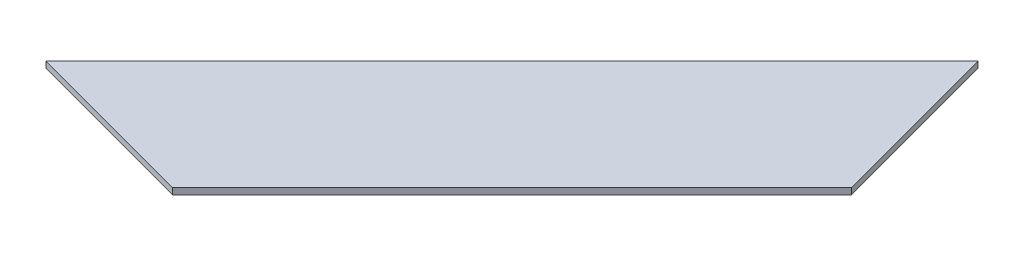
ISO-10303-21;
HEADER;
FILE_DESCRIPTION(('STEP AP214'),'2;1');
FILE_NAME('part.step','',(''),(''),'','','');
FILE_SCHEMA(('AUTOMOTIVE_DESIGN { 1 0 10303 214 1 1 1 1 }'));
ENDSEC;
DATA;
#1=APPLICATION_CONTEXT('core data for automotive mechanical design processes');
#2=APPLICATION_PROTOCOL_DEFINITION('international standard','automotive_design',2000,#1);
#3=PRODUCT_CONTEXT('',#1,'mechanical');
#4=PRODUCT('Part','Part','',(#3));
#5=PRODUCT_RELATED_PRODUCT_CATEGORY('part','',(#4));
#6=PRODUCT_DEFINITION_FORMATION('','',#4);
#7=PRODUCT_DEFINITION_CONTEXT('part definition',#1,'design');
#8=PRODUCT_DEFINITION('design','',#6,#7);
#9=PRODUCT_DEFINITION_SHAPE('','',#8);
#10=(LENGTH_UNIT() NAMED_UNIT(*) SI_UNIT(.MILLI.,.METRE.));
#11=(NAMED_UNIT(*) PLANE_ANGLE_UNIT() SI_UNIT($,.RADIAN.));
#12=(NAMED_UNIT(*) SI_UNIT($,.STERADIAN.) SOLID_ANGLE_UNIT());
#13=UNCERTAINTY_MEASURE_WITH_UNIT(LENGTH_MEASURE(1.E-05),#10,'distance_accuracy_value','');
#14=(GEOMETRIC_REPRESENTATION_CONTEXT(3) GLOBAL_UNCERTAINTY_ASSIGNED_CONTEXT((#13)) GLOBAL_UNIT_ASSIGNED_CONTEXT((#10,
#11,#12)) REPRESENTATION_CONTEXT('',''));
#15=CARTESIAN_POINT('',(0.,0.,0.));
#16=DIRECTION('',(0.,0.,1.));
#17=DIRECTION('',(1.,0.,0.));
#18=AXIS2_PLACEMENT_3D('',#15,#16,#17);
#19=CARTESIAN_POINT('',(72.7074958892098,10.,-15.6364280773444));
#20=DIRECTION('',(0.707106781186548,0.,0.707106781186547));
#21=DIRECTION('',(0.707106781186547,0.,-0.707106781186548));
#22=AXIS2_PLACEMENT_3D('',#19,#20,#21);
#23=PLANE('',#22);
#24=DIRECTION('',(0.,1.,0.));
#25=VECTOR('',#24,1.);
#26=CARTESIAN_POINT('',(61.7621761745411,10.,-4.69110836267558));
#27=LINE('',#26,#25);
#28=CARTESIAN_POINT('',(61.7621761745411,10.,-4.69110836267558));
#29=VERTEX_POINT('',#28);
#30=CARTESIAN_POINT('',(61.7621761745411,10.2,-4.69110836267558));
#31=VERTEX_POINT('',#30);
#32=EDGE_CURVE('E11',#29,#31,#27,.T.);
#33=ORIENTED_EDGE('',*,*,#32,.F.);
#34=DIRECTION('',(0.707106781186547,0.,-0.707106781186548));
#35=VECTOR('',#34,1.);
#36=CARTESIAN_POINT('',(72.7074958892098,10.,-15.6364280773444));
#37=LINE('',#36,#35);
#38=CARTESIAN_POINT('',(72.7074958892098,10.,-15.6364280773444));
#39=VERTEX_POINT('',#38);
#40=EDGE_CURVE('E88',#29,#39,#37,.T.);
#41=ORIENTED_EDGE('',*,*,#40,.T.);
#42=DIRECTION('',(0.,1.,0.));
#43=VECTOR('',#42,1.);
#44=CARTESIAN_POINT('',(72.7074958892098,10.,-15.6364280773444));
#45=LINE('',#44,#43);
#46=CARTESIAN_POINT('',(72.7074958892098,10.2,-15.6364280773444));
#47=VERTEX_POINT('',#46);
#48=EDGE_CURVE('E43',#39,#47,#45,.T.);
#49=ORIENTED_EDGE('',*,*,#48,.T.);
#50=DIRECTION('',(0.707106781186547,0.,-0.707106781186548));
#51=VECTOR('',#50,1.);
#52=CARTESIAN_POINT('',(72.7074958892098,10.2,-15.6364280773444));
#53=LINE('',#52,#51);
#54=EDGE_CURVE('E101',#31,#47,#53,.T.);
#55=ORIENTED_EDGE('',*,*,#54,.F.);
#56=EDGE_LOOP('',(#33,#41,#49,#55));
#57=FACE_BOUND('',#56,.T.);
#58=ADVANCED_FACE('F33',(#57),#23,.T.);
#59=CARTESIAN_POINT('',(71.2132034355964,10.,-21.2132034355964));
#60=DIRECTION('',(0.96592582628907,0.,-0.258819045102516));
#61=DIRECTION('',(-0.258819045102516,0.,-0.96592582628907));
#62=AXIS2_PLACEMENT_3D('',#59,#60,#61);
#63=PLANE('',#62);
#64=ORIENTED_EDGE('',*,*,#48,.F.);
#65=DIRECTION('',(-0.258819045102516,0.,-0.96592582628907));
#66=VECTOR('',#65,1.);
#67=CARTESIAN_POINT('',(71.2132034355964,10.,-21.2132034355964));
#68=LINE('',#67,#66);
#69=CARTESIAN_POINT('',(71.2132034355964,10.,-21.2132034355964));
#70=VERTEX_POINT('',#69);
#71=EDGE_CURVE('E95',#39,#70,#68,.T.);
#72=ORIENTED_EDGE('',*,*,#71,.T.);
#73=DIRECTION('',(0.,1.,0.));
#74=VECTOR('',#73,1.);
#75=CARTESIAN_POINT('',(71.2132034355964,10.,-21.2132034355964));
#76=LINE('',#75,#74);
#77=CARTESIAN_POINT('',(71.2132034355964,10.2,-21.2132034355964));
#78=VERTEX_POINT('',#77);
#79=EDGE_CURVE('E51',#70,#78,#76,.T.);
#80=ORIENTED_EDGE('',*,*,#79,.T.);
#81=DIRECTION('',(-0.258819045102516,0.,-0.96592582628907));
#82=VECTOR('',#81,1.);
#83=CARTESIAN_POINT('',(71.2132034355964,10.2,-21.2132034355964));
#84=LINE('',#83,#82);
#85=EDGE_CURVE('E82',#47,#78,#84,.T.);
#86=ORIENTED_EDGE('',*,*,#85,.F.);
#87=EDGE_LOOP('',(#64,#72,#80,#86));
#88=FACE_BOUND('',#87,.T.);
#89=ADVANCED_FACE('F105',(#88),#63,.T.);
#90=CARTESIAN_POINT('',(25.,10.,25.));
#91=DIRECTION('',(0.707106781186548,0.,0.707106781186547));
#92=DIRECTION('',(0.707106781186547,0.,-0.707106781186548));
#93=AXIS2_PLACEMENT_3D('',#90,#91,#92);
#94=PLANE('',#93);
#95=ORIENTED_EDGE('',*,*,#79,.F.);
#96=DIRECTION('',(0.707106781186547,0.,-0.707106781186548));
#97=VECTOR('',#96,1.);
#98=CARTESIAN_POINT('',(25.,10.,25.));
#99=LINE('',#98,#97);
#100=CARTESIAN_POINT('',(56.185400816289,10.,-6.18540081628899));
#101=VERTEX_POINT('',#100);
#102=EDGE_CURVE('E87',#101,#70,#99,.T.);
#103=ORIENTED_EDGE('',*,*,#102,.F.);
#104=DIRECTION('',(0.,1.,0.));
#105=VECTOR('',#104,1.);
#106=CARTESIAN_POINT('',(56.185400816289,10.,-6.18540081628899));
#107=LINE('',#106,#105);
#108=CARTESIAN_POINT('',(56.185400816289,10.2,-6.18540081628899));
#109=VERTEX_POINT('',#108);
#110=EDGE_CURVE('E37',#101,#109,#107,.T.);
#111=ORIENTED_EDGE('',*,*,#110,.T.);
#112=DIRECTION('',(0.707106781186547,0.,-0.707106781186548));
#113=VECTOR('',#112,1.);
#114=CARTESIAN_POINT('',(25.,10.2,25.));
#115=LINE('',#114,#113);
#116=EDGE_CURVE('E97',#109,#78,#115,.T.);
#117=ORIENTED_EDGE('',*,*,#116,.T.);
#118=EDGE_LOOP('',(#95,#103,#111,#117));
#119=FACE_BOUND('',#118,.T.);
#120=ADVANCED_FACE('F90',(#119),#94,.F.);
#121=CARTESIAN_POINT('',(61.7621761745411,10.,-4.69110836267558));
#122=DIRECTION('',(-0.258819045102517,0.,0.965925826289069));
#123=DIRECTION('',(0.965925826289069,0.,0.258819045102517));
#124=AXIS2_PLACEMENT_3D('',#121,#122,#123);
#125=PLANE('',#124);
#126=DIRECTION('',(0.965925826289069,0.,0.258819045102517));
#127=VECTOR('',#126,1.);
#128=CARTESIAN_POINT('',(61.7621761745411,10.,-4.69110836267558));
#129=LINE('',#128,#127);
#130=EDGE_CURVE('E76',#101,#29,#129,.T.);
#131=ORIENTED_EDGE('',*,*,#130,.T.);
#132=ORIENTED_EDGE('',*,*,#32,.T.);
#133=DIRECTION('',(0.965925826289069,0.,0.258819045102517));
#134=VECTOR('',#133,1.);
#135=CARTESIAN_POINT('',(61.7621761745411,10.2,-4.69110836267558));
#136=LINE('',#135,#134);
#137=EDGE_CURVE('E78',#109,#31,#136,.T.);
#138=ORIENTED_EDGE('',*,*,#137,.F.);
#139=ORIENTED_EDGE('',*,*,#110,.F.);
#140=EDGE_LOOP('',(#131,#132,#138,#139));
#141=FACE_BOUND('',#140,.T.);
#142=ADVANCED_FACE('F35',(#141),#125,.T.);
#143=CARTESIAN_POINT('',(0.,10.2,0.));
#144=DIRECTION('',(0.,1.,0.));
#145=DIRECTION('',(0.,0.,1.));
#146=AXIS2_PLACEMENT_3D('',#143,#144,#145);
#147=PLANE('',#146);
#148=ORIENTED_EDGE('',*,*,#116,.F.);
#149=ORIENTED_EDGE('',*,*,#137,.T.);
#150=ORIENTED_EDGE('',*,*,#54,.T.);
#151=ORIENTED_EDGE('',*,*,#85,.T.);
#152=EDGE_LOOP('',(#148,#149,#150,#151));
#153=FACE_BOUND('',#152,.T.);
#154=ADVANCED_FACE('F104',(#153),#147,.T.);
#155=CARTESIAN_POINT('',(0.,10.,0.));
#156=DIRECTION('',(0.,1.,0.));
#157=DIRECTION('',(0.,0.,1.));
#158=AXIS2_PLACEMENT_3D('',#155,#156,#157);
#159=PLANE('',#158);
#160=ORIENTED_EDGE('',*,*,#102,.T.);
#161=ORIENTED_EDGE('',*,*,#71,.F.);
#162=ORIENTED_EDGE('',*,*,#40,.F.);
#163=ORIENTED_EDGE('',*,*,#130,.F.);
#164=EDGE_LOOP('',(#160,#161,#162,#163));
#165=FACE_BOUND('',#164,.T.);
#166=ADVANCED_FACE('F85',(#165),#159,.F.);
#167=CLOSED_SHELL('',(#58,#89,#120,#142,#154,#166));
#168=MANIFOLD_SOLID_BREP('B2',#167);
#169=ADVANCED_BREP_SHAPE_REPRESENTATION('',(#18,#168),#14);
#170=SHAPE_DEFINITION_REPRESENTATION(#9,#169);
ENDSEC;
END-ISO-10303-21;
